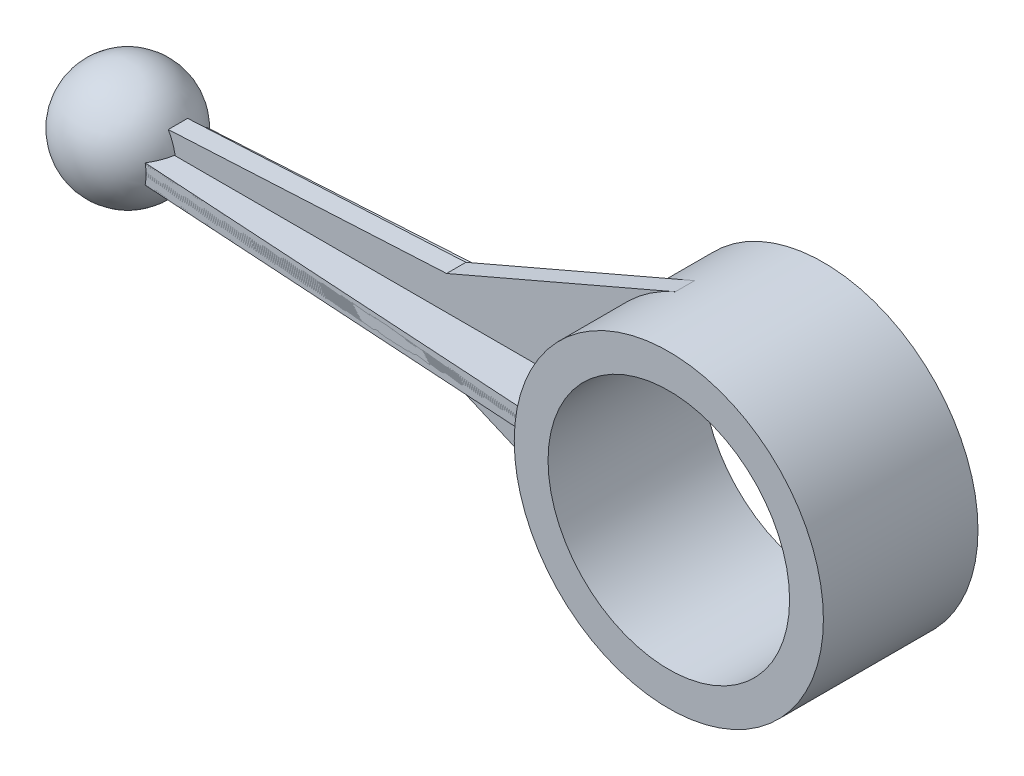
ISO-10303-21;
HEADER;
FILE_DESCRIPTION(('STEP AP214'),'2;1');
FILE_NAME('part.step','',(''),(''),'','','');
FILE_SCHEMA(('AUTOMOTIVE_DESIGN { 1 0 10303 214 1 1 1 1 }'));
ENDSEC;
DATA;
#1=APPLICATION_CONTEXT('core data for automotive mechanical design processes');
#2=APPLICATION_PROTOCOL_DEFINITION('international standard','automotive_design',2000,#1);
#3=PRODUCT_CONTEXT('',#1,'mechanical');
#4=PRODUCT('Part','Part','',(#3));
#5=PRODUCT_RELATED_PRODUCT_CATEGORY('part','',(#4));
#6=PRODUCT_DEFINITION_FORMATION('','',#4);
#7=PRODUCT_DEFINITION_CONTEXT('part definition',#1,'design');
#8=PRODUCT_DEFINITION('design','',#6,#7);
#9=PRODUCT_DEFINITION_SHAPE('','',#8);
#10=(LENGTH_UNIT() NAMED_UNIT(*) SI_UNIT(.MILLI.,.METRE.));
#11=(NAMED_UNIT(*) PLANE_ANGLE_UNIT() SI_UNIT($,.RADIAN.));
#12=(NAMED_UNIT(*) SI_UNIT($,.STERADIAN.) SOLID_ANGLE_UNIT());
#13=UNCERTAINTY_MEASURE_WITH_UNIT(LENGTH_MEASURE(1.E-05),#10,'distance_accuracy_value','');
#14=(GEOMETRIC_REPRESENTATION_CONTEXT(3) GLOBAL_UNCERTAINTY_ASSIGNED_CONTEXT((#13)) GLOBAL_UNIT_ASSIGNED_CONTEXT((#10,
#11,#12)) REPRESENTATION_CONTEXT('',''));
#15=CARTESIAN_POINT('',(0.,0.,0.));
#16=DIRECTION('',(0.,0.,1.));
#17=DIRECTION('',(1.,0.,0.));
#18=AXIS2_PLACEMENT_3D('',#15,#16,#17);
#19=CARTESIAN_POINT('',(-6.5,0.5,-3.));
#20=DIRECTION('',(-1.,0.,0.));
#21=DIRECTION('',(0.,0.,1.));
#22=AXIS2_PLACEMENT_3D('',#19,#20,#21);
#23=PLANE('',#22);
#24=DIRECTION('',(0.,0.,-1.));
#25=VECTOR('',#24,1.);
#26=CARTESIAN_POINT('',(-6.5,-0.5,-3.));
#27=LINE('',#26,#25);
#28=CARTESIAN_POINT('',(-6.5,-0.5,-0.499999999999999));
#29=VERTEX_POINT('',#28);
#30=CARTESIAN_POINT('',(-6.5,-0.5,-3.));
#31=VERTEX_POINT('',#30);
#32=EDGE_CURVE('E88',#29,#31,#27,.T.);
#33=ORIENTED_EDGE('',*,*,#32,.T.);
#34=DIRECTION('',(0.,-1.,0.));
#35=VECTOR('',#34,1.);
#36=CARTESIAN_POINT('',(-6.5,0.5,-3.));
#37=LINE('',#36,#35);
#38=CARTESIAN_POINT('',(-6.5,0.5,-3.));
#39=VERTEX_POINT('',#38);
#40=EDGE_CURVE('E12',#39,#31,#37,.T.);
#41=ORIENTED_EDGE('',*,*,#40,.F.);
#42=DIRECTION('',(0.,0.,-1.));
#43=VECTOR('',#42,1.);
#44=CARTESIAN_POINT('',(-6.5,0.5,-3.));
#45=LINE('',#44,#43);
#46=CARTESIAN_POINT('',(-6.5,0.5,-0.499999999999999));
#47=VERTEX_POINT('',#46);
#48=EDGE_CURVE('E107',#47,#39,#45,.T.);
#49=ORIENTED_EDGE('',*,*,#48,.F.);
#50=DIRECTION('',(0.,-1.,0.));
#51=VECTOR('',#50,1.);
#52=CARTESIAN_POINT('',(-6.5,0.5,-0.499999999999999));
#53=LINE('',#52,#51);
#54=EDGE_CURVE('E101',#47,#29,#53,.T.);
#55=ORIENTED_EDGE('',*,*,#54,.T.);
#56=EDGE_LOOP('',(#33,#41,#49,#55));
#57=FACE_BOUND('',#56,.T.);
#58=ADVANCED_FACE('F45',(#57),#23,.F.);
#59=CARTESIAN_POINT('',(-31.,0.5,-1.49999999999999));
#60=DIRECTION('',(0.0611100632795035,0.,0.99813103356522));
#61=DIRECTION('',(0.99813103356522,0.,-0.0611100632795035));
#62=AXIS2_PLACEMENT_3D('',#59,#60,#61);
#63=PLANE('',#62);
#64=DIRECTION('',(-0.99813103356522,0.,0.0611100632795035));
#65=VECTOR('',#64,1.);
#66=CARTESIAN_POINT('',(-31.,-0.5,-1.49999999999999));
#67=LINE('',#66,#65);
#68=CARTESIAN_POINT('',(-31.,-0.5,-1.49999999999999));
#69=VERTEX_POINT('',#68);
#70=EDGE_CURVE('E85',#31,#69,#67,.T.);
#71=ORIENTED_EDGE('',*,*,#70,.T.);
#72=DIRECTION('',(0.,-1.,0.));
#73=VECTOR('',#72,1.);
#74=CARTESIAN_POINT('',(-31.,0.5,-1.49999999999999));
#75=LINE('',#74,#73);
#76=CARTESIAN_POINT('',(-31.,0.5,-1.49999999999999));
#77=VERTEX_POINT('',#76);
#78=EDGE_CURVE('E52',#77,#69,#75,.T.);
#79=ORIENTED_EDGE('',*,*,#78,.F.);
#80=DIRECTION('',(-0.99813103356522,0.,0.0611100632795035));
#81=VECTOR('',#80,1.);
#82=CARTESIAN_POINT('',(-31.,0.5,-1.49999999999999));
#83=LINE('',#82,#81);
#84=EDGE_CURVE('E97',#39,#77,#83,.T.);
#85=ORIENTED_EDGE('',*,*,#84,.F.);
#86=ORIENTED_EDGE('',*,*,#40,.T.);
#87=EDGE_LOOP('',(#71,#79,#85,#86));
#88=FACE_BOUND('',#87,.T.);
#89=ADVANCED_FACE('F96',(#88),#63,.F.);
#90=CARTESIAN_POINT('',(-31.,0.5,-0.499999999999995));
#91=DIRECTION('',(1.,0.,0.));
#92=DIRECTION('',(0.,0.,-1.));
#93=AXIS2_PLACEMENT_3D('',#90,#91,#92);
#94=PLANE('',#93);
#95=DIRECTION('',(0.,0.,1.));
#96=VECTOR('',#95,1.);
#97=CARTESIAN_POINT('',(-31.,-0.5,-0.499999999999995));
#98=LINE('',#97,#96);
#99=CARTESIAN_POINT('',(-31.,-0.5,-0.499999999999995));
#100=VERTEX_POINT('',#99);
#101=EDGE_CURVE('E90',#69,#100,#98,.T.);
#102=ORIENTED_EDGE('',*,*,#101,.T.);
#103=DIRECTION('',(0.,-1.,0.));
#104=VECTOR('',#103,1.);
#105=CARTESIAN_POINT('',(-31.,0.5,-0.499999999999995));
#106=LINE('',#105,#104);
#107=CARTESIAN_POINT('',(-31.,0.5,-0.499999999999995));
#108=VERTEX_POINT('',#107);
#109=EDGE_CURVE('E113',#108,#100,#106,.T.);
#110=ORIENTED_EDGE('',*,*,#109,.F.);
#111=DIRECTION('',(0.,0.,1.));
#112=VECTOR('',#111,1.);
#113=CARTESIAN_POINT('',(-31.,0.5,-0.499999999999995));
#114=LINE('',#113,#112);
#115=EDGE_CURVE('E64',#77,#108,#114,.T.);
#116=ORIENTED_EDGE('',*,*,#115,.F.);
#117=ORIENTED_EDGE('',*,*,#78,.T.);
#118=EDGE_LOOP('',(#102,#110,#116,#117));
#119=FACE_BOUND('',#118,.T.);
#120=ADVANCED_FACE('F116',(#119),#94,.F.);
#121=CARTESIAN_POINT('',(-6.5,0.5,-0.499999999999999));
#122=DIRECTION('',(0.,0.,-1.));
#123=DIRECTION('',(-1.,0.,0.));
#124=AXIS2_PLACEMENT_3D('',#121,#122,#123);
#125=PLANE('',#124);
#126=DIRECTION('',(1.,0.,0.));
#127=VECTOR('',#126,1.);
#128=CARTESIAN_POINT('',(-6.5,-0.5,-0.499999999999999));
#129=LINE('',#128,#127);
#130=EDGE_CURVE('E105',#100,#29,#129,.T.);
#131=ORIENTED_EDGE('',*,*,#130,.T.);
#132=ORIENTED_EDGE('',*,*,#54,.F.);
#133=DIRECTION('',(1.,0.,0.));
#134=VECTOR('',#133,1.);
#135=CARTESIAN_POINT('',(-15.,0.5,-0.5));
#136=LINE('',#135,#134);
#137=EDGE_CURVE('E59',#108,#47,#136,.T.);
#138=ORIENTED_EDGE('',*,*,#137,.F.);
#139=ORIENTED_EDGE('',*,*,#109,.T.);
#140=EDGE_LOOP('',(#131,#132,#138,#139));
#141=FACE_BOUND('',#140,.T.);
#142=ADVANCED_FACE('F118',(#141),#125,.F.);
#143=CARTESIAN_POINT('',(-6.5,0.5,-0.499999999999999));
#144=DIRECTION('',(0.,-1.,0.));
#145=DIRECTION('',(0.,0.,-1.));
#146=AXIS2_PLACEMENT_3D('',#143,#144,#145);
#147=PLANE('',#146);
#148=ORIENTED_EDGE('',*,*,#48,.T.);
#149=ORIENTED_EDGE('',*,*,#84,.T.);
#150=ORIENTED_EDGE('',*,*,#115,.T.);
#151=ORIENTED_EDGE('',*,*,#137,.T.);
#152=EDGE_LOOP('',(#148,#149,#150,#151));
#153=FACE_BOUND('',#152,.T.);
#154=ADVANCED_FACE('F119',(#153),#147,.F.);
#155=CARTESIAN_POINT('',(-6.5,-0.5,-0.499999999999999));
#156=DIRECTION('',(0.,-1.,0.));
#157=DIRECTION('',(0.,0.,-1.));
#158=AXIS2_PLACEMENT_3D('',#155,#156,#157);
#159=PLANE('',#158);
#160=ORIENTED_EDGE('',*,*,#32,.F.);
#161=ORIENTED_EDGE('',*,*,#130,.F.);
#162=ORIENTED_EDGE('',*,*,#101,.F.);
#163=ORIENTED_EDGE('',*,*,#70,.F.);
#164=EDGE_LOOP('',(#160,#161,#162,#163));
#165=FACE_BOUND('',#164,.T.);
#166=ADVANCED_FACE('F86',(#165),#159,.T.);
#167=CLOSED_SHELL('',(#58,#89,#120,#142,#154,#166));
#168=MANIFOLD_SOLID_BREP('B2',#167);
#169=CARTESIAN_POINT('',(-32.,0.,0.));
#170=DIRECTION('',(0.,1.,0.));
#171=DIRECTION('',(1.,0.,0.));
#172=AXIS2_PLACEMENT_3D('',#169,#170,#171);
#173=SPHERICAL_SURFACE('',#172,3.);
#174=CARTESIAN_POINT('',(-32.0877593360996,0.,1.43340248962655));
#175=DIRECTION('',(0.0611100632795035,0.,-0.99813103356522));
#176=DIRECTION('',(-0.99813103356522,0.,-0.0611100632795035));
#177=AXIS2_PLACEMENT_3D('',#174,#175,#176);
#178=CIRCLE('',#177,2.63394297615946);
#179=CARTESIAN_POINT('',(-29.5065423839267,-0.5,1.59143618057591));
#180=VERTEX_POINT('',#179);
#181=CARTESIAN_POINT('',(-29.5065423839267,0.5,1.59143618057591));
#182=VERTEX_POINT('',#181);
#183=EDGE_CURVE('E187',#180,#182,#178,.F.);
#184=ORIENTED_EDGE('',*,*,#183,.T.);
#185=CARTESIAN_POINT('',(-32.,0.5,0.));
#186=DIRECTION('',(0.,-1.,0.));
#187=DIRECTION('',(0.,0.,-1.));
#188=AXIS2_PLACEMENT_3D('',#185,#186,#187);
#189=CIRCLE('',#188,2.95803989154981);
#190=CARTESIAN_POINT('',(-29.0845240525774,0.5,0.500000000000002));
#191=VERTEX_POINT('',#190);
#192=EDGE_CURVE('E43',#182,#191,#189,.F.);
#193=ORIENTED_EDGE('',*,*,#192,.T.);
#194=CARTESIAN_POINT('',(-32.,0.,0.500000000000001));
#195=DIRECTION('',(0.,0.,1.));
#196=DIRECTION('',(1.,0.,0.));
#197=AXIS2_PLACEMENT_3D('',#194,#195,#196);
#198=CIRCLE('',#197,2.95803989154981);
#199=CARTESIAN_POINT('',(-29.0845240525774,-0.5,0.500000000000001));
#200=VERTEX_POINT('',#199);
#201=EDGE_CURVE('E249',#191,#200,#198,.F.);
#202=ORIENTED_EDGE('',*,*,#201,.T.);
#203=CARTESIAN_POINT('',(-32.,-0.5,0.));
#204=DIRECTION('',(0.,-1.,0.));
#205=DIRECTION('',(0.,0.,-1.));
#206=AXIS2_PLACEMENT_3D('',#203,#204,#205);
#207=CIRCLE('',#206,2.95803989154981);
#208=EDGE_CURVE('E247',#180,#200,#207,.F.);
#209=ORIENTED_EDGE('',*,*,#208,.F.);
#210=EDGE_LOOP('',(#184,#193,#202,#209));
#211=FACE_BOUND('',#210,.T.);
#212=ADVANCED_FACE('F180',(#211),#173,.T.);
#213=CARTESIAN_POINT('',(-6.5,0.5,3.));
#214=DIRECTION('',(-1.,0.,0.));
#215=DIRECTION('',(0.,0.,-1.));
#216=AXIS2_PLACEMENT_3D('',#213,#214,#215);
#217=PLANE('',#216);
#218=DIRECTION('',(0.,0.,1.));
#219=VECTOR('',#218,1.);
#220=CARTESIAN_POINT('',(-6.5,-0.5,3.));
#221=LINE('',#220,#219);
#222=CARTESIAN_POINT('',(-6.5,-0.5,0.499999999999999));
#223=VERTEX_POINT('',#222);
#224=CARTESIAN_POINT('',(-6.5,-0.5,3.));
#225=VERTEX_POINT('',#224);
#226=EDGE_CURVE('E231',#223,#225,#221,.T.);
#227=ORIENTED_EDGE('',*,*,#226,.F.);
#228=DIRECTION('',(0.,-1.,0.));
#229=VECTOR('',#228,1.);
#230=CARTESIAN_POINT('',(-6.5,0.5,0.499999999999999));
#231=LINE('',#230,#229);
#232=CARTESIAN_POINT('',(-6.5,0.5,0.499999999999999));
#233=VERTEX_POINT('',#232);
#234=EDGE_CURVE('E225',#233,#223,#231,.T.);
#235=ORIENTED_EDGE('',*,*,#234,.F.);
#236=DIRECTION('',(0.,0.,1.));
#237=VECTOR('',#236,1.);
#238=CARTESIAN_POINT('',(-6.5,0.5,3.));
#239=LINE('',#238,#237);
#240=CARTESIAN_POINT('',(-6.5,0.5,3.));
#241=VERTEX_POINT('',#240);
#242=EDGE_CURVE('E233',#233,#241,#239,.T.);
#243=ORIENTED_EDGE('',*,*,#242,.T.);
#244=DIRECTION('',(0.,-1.,0.));
#245=VECTOR('',#244,1.);
#246=CARTESIAN_POINT('',(-6.5,0.5,3.));
#247=LINE('',#246,#245);
#248=EDGE_CURVE('E219',#241,#225,#247,.T.);
#249=ORIENTED_EDGE('',*,*,#248,.T.);
#250=EDGE_LOOP('',(#227,#235,#243,#249));
#251=FACE_BOUND('',#250,.T.);
#252=ADVANCED_FACE('F229',(#251),#217,.F.);
#253=CARTESIAN_POINT('',(-31.,0.5,1.49999999999999));
#254=DIRECTION('',(0.0611100632795035,0.,-0.99813103356522));
#255=DIRECTION('',(0.99813103356522,0.,0.0611100632795035));
#256=AXIS2_PLACEMENT_3D('',#253,#254,#255);
#257=PLANE('',#256);
#258=ORIENTED_EDGE('',*,*,#183,.F.);
#259=DIRECTION('',(-0.99813103356522,0.,-0.0611100632795035));
#260=VECTOR('',#259,1.);
#261=CARTESIAN_POINT('',(-31.,-0.5,1.49999999999999));
#262=LINE('',#261,#260);
#263=EDGE_CURVE('E215',#225,#180,#262,.T.);
#264=ORIENTED_EDGE('',*,*,#263,.F.);
#265=ORIENTED_EDGE('',*,*,#248,.F.);
#266=DIRECTION('',(-0.99813103356522,0.,-0.0611100632795035));
#267=VECTOR('',#266,1.);
#268=CARTESIAN_POINT('',(-31.,0.5,1.49999999999999));
#269=LINE('',#268,#267);
#270=EDGE_CURVE('E224',#241,#182,#269,.T.);
#271=ORIENTED_EDGE('',*,*,#270,.T.);
#272=EDGE_LOOP('',(#258,#264,#265,#271));
#273=FACE_BOUND('',#272,.T.);
#274=ADVANCED_FACE('F217',(#273),#257,.F.);
#275=CARTESIAN_POINT('',(-6.5,0.5,0.499999999999999));
#276=DIRECTION('',(0.,0.,1.));
#277=DIRECTION('',(-1.,0.,0.));
#278=AXIS2_PLACEMENT_3D('',#275,#276,#277);
#279=PLANE('',#278);
#280=ORIENTED_EDGE('',*,*,#201,.F.);
#281=DIRECTION('',(1.,0.,0.));
#282=VECTOR('',#281,1.);
#283=CARTESIAN_POINT('',(-15.,0.5,0.5));
#284=LINE('',#283,#282);
#285=EDGE_CURVE('E245',#191,#233,#284,.T.);
#286=ORIENTED_EDGE('',*,*,#285,.T.);
#287=ORIENTED_EDGE('',*,*,#234,.T.);
#288=DIRECTION('',(1.,0.,0.));
#289=VECTOR('',#288,1.);
#290=CARTESIAN_POINT('',(-6.5,-0.5,0.499999999999999));
#291=LINE('',#290,#289);
#292=EDGE_CURVE('E237',#200,#223,#291,.T.);
#293=ORIENTED_EDGE('',*,*,#292,.F.);
#294=EDGE_LOOP('',(#280,#286,#287,#293));
#295=FACE_BOUND('',#294,.T.);
#296=ADVANCED_FACE('F252',(#295),#279,.F.);
#297=CARTESIAN_POINT('',(-6.5,0.5,0.499999999999999));
#298=DIRECTION('',(0.,-1.,0.));
#299=DIRECTION('',(0.,0.,1.));
#300=AXIS2_PLACEMENT_3D('',#297,#298,#299);
#301=PLANE('',#300);
#302=ORIENTED_EDGE('',*,*,#192,.F.);
#303=ORIENTED_EDGE('',*,*,#270,.F.);
#304=ORIENTED_EDGE('',*,*,#242,.F.);
#305=ORIENTED_EDGE('',*,*,#285,.F.);
#306=EDGE_LOOP('',(#302,#303,#304,#305));
#307=FACE_BOUND('',#306,.T.);
#308=ADVANCED_FACE('F254',(#307),#301,.F.);
#309=CARTESIAN_POINT('',(-6.5,-0.5,0.499999999999999));
#310=DIRECTION('',(0.,-1.,0.));
#311=DIRECTION('',(0.,0.,1.));
#312=AXIS2_PLACEMENT_3D('',#309,#310,#311);
#313=PLANE('',#312);
#314=ORIENTED_EDGE('',*,*,#263,.T.);
#315=ORIENTED_EDGE('',*,*,#208,.T.);
#316=ORIENTED_EDGE('',*,*,#292,.T.);
#317=ORIENTED_EDGE('',*,*,#226,.T.);
#318=EDGE_LOOP('',(#314,#315,#316,#317));
#319=FACE_BOUND('',#318,.T.);
#320=ADVANCED_FACE('F235',(#319),#313,.T.);
#321=CLOSED_SHELL('',(#212,#252,#274,#296,#308,#320));
#322=MANIFOLD_SOLID_BREP('B6',#321);
#323=CARTESIAN_POINT('',(0.,0.,4.));
#324=DIRECTION('',(0.,0.,-1.));
#325=DIRECTION('',(-1.,0.,0.));
#326=AXIS2_PLACEMENT_3D('',#323,#324,#325);
#327=CYLINDRICAL_SURFACE('',#326,8.);
#328=CARTESIAN_POINT('',(0.,0.,-4.));
#329=DIRECTION('',(0.,0.,1.));
#330=DIRECTION('',(1.,0.,0.));
#331=AXIS2_PLACEMENT_3D('',#328,#329,#330);
#332=CIRCLE('',#331,8.);
#333=CARTESIAN_POINT('',(8.,0.,-4.));
#334=VERTEX_POINT('',#333);
#335=EDGE_CURVE('E477',#334,#334,#332,.T.);
#336=ORIENTED_EDGE('',*,*,#335,.T.);
#337=EDGE_LOOP('',(#336));
#338=FACE_BOUND('',#337,.T.);
#339=CARTESIAN_POINT('',(0.,0.,4.));
#340=DIRECTION('',(0.,0.,1.));
#341=DIRECTION('',(1.,0.,0.));
#342=AXIS2_PLACEMENT_3D('',#339,#340,#341);
#343=CIRCLE('',#342,8.);
#344=CARTESIAN_POINT('',(8.,0.,4.));
#345=VERTEX_POINT('',#344);
#346=EDGE_CURVE('E480',#345,#345,#343,.T.);
#347=ORIENTED_EDGE('',*,*,#346,.F.);
#348=EDGE_LOOP('',(#347));
#349=FACE_BOUND('',#348,.T.);
#350=DIRECTION('',(0.,0.,-1.));
#351=VECTOR('',#350,1.);
#352=CARTESIAN_POINT('',(-7.98435971133565,0.5,4.));
#353=LINE('',#352,#351);
#354=CARTESIAN_POINT('',(-7.98435971133567,0.5,2.90912083399986));
#355=VERTEX_POINT('',#354);
#356=CARTESIAN_POINT('',(-7.98435971133566,0.5,0.5));
#357=VERTEX_POINT('',#356);
#358=EDGE_CURVE('E320',#355,#357,#353,.T.);
#359=ORIENTED_EDGE('',*,*,#358,.F.);
#360=CARTESIAN_POINT('',(0.,0.,3.39795918367347));
#361=DIRECTION('',(0.0611100632795035,0.,-0.99813103356522));
#362=DIRECTION('',(-0.99813103356522,0.,-0.0611100632795035));
#363=AXIS2_PLACEMENT_3D('',#360,#361,#362);
#364=ELLIPSE('',#363,8.01497972808723,8.);
#365=CARTESIAN_POINT('',(-7.98435971133566,-0.5,2.90912083399986));
#366=VERTEX_POINT('',#365);
#367=EDGE_CURVE('E178',#366,#355,#364,.T.);
#368=ORIENTED_EDGE('',*,*,#367,.F.);
#369=DIRECTION('',(0.,0.,-1.));
#370=VECTOR('',#369,1.);
#371=CARTESIAN_POINT('',(-7.98435971133565,-0.5,4.));
#372=LINE('',#371,#370);
#373=CARTESIAN_POINT('',(-7.98435971133566,-0.5,0.499999999999999));
#374=VERTEX_POINT('',#373);
#375=EDGE_CURVE('E392',#366,#374,#372,.T.);
#376=ORIENTED_EDGE('',*,*,#375,.T.);
#377=CARTESIAN_POINT('',(0.,0.,0.5));
#378=DIRECTION('',(0.,0.,-1.));
#379=DIRECTION('',(1.,0.,0.));
#380=AXIS2_PLACEMENT_3D('',#377,#378,#379);
#381=CIRCLE('',#380,8.);
#382=CARTESIAN_POINT('',(-3.1645425419637,-7.34749416468649,0.5));
#383=VERTEX_POINT('',#382);
#384=EDGE_CURVE('E456',#383,#374,#381,.T.);
#385=ORIENTED_EDGE('',*,*,#384,.F.);
#386=DIRECTION('',(0.,0.,-1.));
#387=VECTOR('',#386,1.);
#388=CARTESIAN_POINT('',(-3.1645425419637,-7.34749416468649,0.5));
#389=LINE('',#388,#387);
#390=CARTESIAN_POINT('',(-3.16454254196369,-7.34749416468649,-0.5));
#391=VERTEX_POINT('',#390);
#392=EDGE_CURVE('E434',#383,#391,#389,.T.);
#393=ORIENTED_EDGE('',*,*,#392,.T.);
#394=CARTESIAN_POINT('',(0.,0.,-0.5));
#395=DIRECTION('',(0.,0.,-1.));
#396=DIRECTION('',(1.,0.,0.));
#397=AXIS2_PLACEMENT_3D('',#394,#395,#396);
#398=CIRCLE('',#397,8.);
#399=CARTESIAN_POINT('',(-3.1645425419637,7.34749416468649,-0.5));
#400=VERTEX_POINT('',#399);
#401=EDGE_CURVE('E444',#391,#400,#398,.T.);
#402=ORIENTED_EDGE('',*,*,#401,.T.);
#403=DIRECTION('',(0.,0.,-1.));
#404=VECTOR('',#403,1.);
#405=CARTESIAN_POINT('',(-3.1645425419637,7.34749416468649,0.5));
#406=LINE('',#405,#404);
#407=CARTESIAN_POINT('',(-3.1645425419637,7.34749416468649,0.5));
#408=VERTEX_POINT('',#407);
#409=EDGE_CURVE('E468',#408,#400,#406,.T.);
#410=ORIENTED_EDGE('',*,*,#409,.F.);
#411=EDGE_CURVE('E454',#357,#408,#381,.T.);
#412=ORIENTED_EDGE('',*,*,#411,.F.);
#413=EDGE_LOOP('',(#359,#368,#376,#385,#393,#402,#410,#412));
#414=FACE_BOUND('',#413,.T.);
#415=ADVANCED_FACE('F306',(#338,#349,#414),#327,.T.);
#416=CARTESIAN_POINT('',(-32.,0.,0.5));
#417=DIRECTION('',(0.,0.,1.));
#418=DIRECTION('',(1.,0.,0.));
#419=AXIS2_PLACEMENT_3D('',#416,#417,#418);
#420=PLANE('',#419);
#421=CARTESIAN_POINT('',(-32.,0.,0.5));
#422=DIRECTION('',(0.,0.,-1.));
#423=DIRECTION('',(1.,0.,0.));
#424=AXIS2_PLACEMENT_3D('',#421,#422,#423);
#425=CIRCLE('',#424,3.);
#426=CARTESIAN_POINT('',(-29.4019237886467,1.5,0.5));
#427=VERTEX_POINT('',#426);
#428=CARTESIAN_POINT('',(-29.0419601084502,0.5,0.5));
#429=VERTEX_POINT('',#428);
#430=EDGE_CURVE('E451',#427,#429,#425,.T.);
#431=ORIENTED_EDGE('',*,*,#430,.T.);
#432=DIRECTION('',(1.,0.,0.));
#433=VECTOR('',#432,1.);
#434=CARTESIAN_POINT('',(-32.,0.5,0.5));
#435=LINE('',#434,#433);
#436=EDGE_CURVE('E313',#429,#357,#435,.T.);
#437=ORIENTED_EDGE('',*,*,#436,.T.);
#438=ORIENTED_EDGE('',*,*,#411,.T.);
#439=DIRECTION('',(-0.918436770585811,-0.395567817745462,0.));
#440=VECTOR('',#439,1.);
#441=CARTESIAN_POINT('',(-15.,2.25,0.5));
#442=LINE('',#441,#440);
#443=CARTESIAN_POINT('',(-15.,2.25,0.5));
#444=VERTEX_POINT('',#443);
#445=EDGE_CURVE('E458',#408,#444,#442,.T.);
#446=ORIENTED_EDGE('',*,*,#445,.T.);
#447=DIRECTION('',(-0.998646777307309,-0.0520059051812871,0.));
#448=VECTOR('',#447,1.);
#449=CARTESIAN_POINT('',(-29.4019237886467,1.5,0.5));
#450=LINE('',#449,#448);
#451=EDGE_CURVE('E460',#444,#427,#450,.T.);
#452=ORIENTED_EDGE('',*,*,#451,.T.);
#453=EDGE_LOOP('',(#431,#437,#438,#446,#452));
#454=FACE_BOUND('',#453,.T.);
#455=ADVANCED_FACE('F486',(#454),#420,.T.);
#456=CARTESIAN_POINT('',(0.,0.,4.));
#457=DIRECTION('',(0.,0.,1.));
#458=DIRECTION('',(1.,0.,0.));
#459=AXIS2_PLACEMENT_3D('',#456,#457,#458);
#460=PLANE('',#459);
#461=CARTESIAN_POINT('',(0.,0.,4.));
#462=DIRECTION('',(0.,0.,1.));
#463=DIRECTION('',(1.,0.,0.));
#464=AXIS2_PLACEMENT_3D('',#461,#462,#463);
#465=CIRCLE('',#464,6.25);
#466=CARTESIAN_POINT('',(6.25,0.,4.));
#467=VERTEX_POINT('',#466);
#468=EDGE_CURVE('E471',#467,#467,#465,.T.);
#469=ORIENTED_EDGE('',*,*,#468,.F.);
#470=EDGE_LOOP('',(#469));
#471=FACE_BOUND('',#470,.T.);
#472=ORIENTED_EDGE('',*,*,#346,.T.);
#473=EDGE_LOOP('',(#472));
#474=FACE_BOUND('',#473,.T.);
#475=ADVANCED_FACE('F535',(#471,#474),#460,.T.);
#476=CARTESIAN_POINT('',(0.,0.,-4.));
#477=DIRECTION('',(0.,0.,1.));
#478=DIRECTION('',(1.,0.,0.));
#479=AXIS2_PLACEMENT_3D('',#476,#477,#478);
#480=PLANE('',#479);
#481=CARTESIAN_POINT('',(0.,0.,-4.));
#482=DIRECTION('',(0.,0.,1.));
#483=DIRECTION('',(1.,0.,0.));
#484=AXIS2_PLACEMENT_3D('',#481,#482,#483);
#485=CIRCLE('',#484,6.25);
#486=CARTESIAN_POINT('',(6.25,0.,-4.));
#487=VERTEX_POINT('',#486);
#488=EDGE_CURVE('E474',#487,#487,#485,.T.);
#489=ORIENTED_EDGE('',*,*,#488,.T.);
#490=EDGE_LOOP('',(#489));
#491=FACE_BOUND('',#490,.T.);
#492=ORIENTED_EDGE('',*,*,#335,.F.);
#493=EDGE_LOOP('',(#492));
#494=FACE_BOUND('',#493,.T.);
#495=ADVANCED_FACE('F541',(#491,#494),#480,.F.);
#496=CARTESIAN_POINT('',(0.,0.,-4.));
#497=DIRECTION('',(0.,0.,1.));
#498=DIRECTION('',(1.,0.,0.));
#499=AXIS2_PLACEMENT_3D('',#496,#497,#498);
#500=CYLINDRICAL_SURFACE('',#499,6.25);
#501=ORIENTED_EDGE('',*,*,#488,.F.);
#502=EDGE_LOOP('',(#501));
#503=FACE_BOUND('',#502,.T.);
#504=ORIENTED_EDGE('',*,*,#468,.T.);
#505=EDGE_LOOP('',(#504));
#506=FACE_BOUND('',#505,.T.);
#507=ADVANCED_FACE('F546',(#503,#506),#500,.F.);
#508=CARTESIAN_POINT('',(-32.,0.,0.5));
#509=DIRECTION('',(0.,0.,-1.));
#510=DIRECTION('',(-1.,0.,0.));
#511=AXIS2_PLACEMENT_3D('',#508,#509,#510);
#512=CYLINDRICAL_SURFACE('',#511,3.);
#513=CARTESIAN_POINT('',(-32.,0.,-0.5));
#514=DIRECTION('',(0.,0.,-1.));
#515=DIRECTION('',(1.,0.,0.));
#516=AXIS2_PLACEMENT_3D('',#513,#514,#515);
#517=CIRCLE('',#516,3.);
#518=CARTESIAN_POINT('',(-29.4019237886467,1.5,-0.5));
#519=VERTEX_POINT('',#518);
#520=CARTESIAN_POINT('',(-29.4019237886467,-1.5,-0.5));
#521=VERTEX_POINT('',#520);
#522=EDGE_CURVE('E442',#519,#521,#517,.T.);
#523=ORIENTED_EDGE('',*,*,#522,.T.);
#524=DIRECTION('',(0.,0.,-1.));
#525=VECTOR('',#524,1.);
#526=CARTESIAN_POINT('',(-29.4019237886467,-1.5,0.5));
#527=LINE('',#526,#525);
#528=CARTESIAN_POINT('',(-29.4019237886467,-1.5,0.5));
#529=VERTEX_POINT('',#528);
#530=EDGE_CURVE('E439',#529,#521,#527,.T.);
#531=ORIENTED_EDGE('',*,*,#530,.F.);
#532=CARTESIAN_POINT('',(-29.0419601084502,-0.5,0.5));
#533=VERTEX_POINT('',#532);
#534=EDGE_CURVE('E450',#533,#529,#425,.T.);
#535=ORIENTED_EDGE('',*,*,#534,.F.);
#536=EDGE_CURVE('E455',#429,#533,#425,.T.);
#537=ORIENTED_EDGE('',*,*,#536,.F.);
#538=ORIENTED_EDGE('',*,*,#430,.F.);
#539=DIRECTION('',(0.,0.,-1.));
#540=VECTOR('',#539,1.);
#541=CARTESIAN_POINT('',(-29.4019237886467,1.5,0.5));
#542=LINE('',#541,#540);
#543=EDGE_CURVE('E462',#427,#519,#542,.T.);
#544=ORIENTED_EDGE('',*,*,#543,.T.);
#545=EDGE_LOOP('',(#523,#531,#535,#537,#538,#544));
#546=FACE_BOUND('',#545,.T.);
#547=ADVANCED_FACE('F502',(#546),#512,.F.);
#548=CARTESIAN_POINT('',(-15.,2.25,0.5));
#549=DIRECTION('',(0.395567817745462,-0.918436770585811,0.));
#550=DIRECTION('',(0.918436770585811,0.395567817745462,0.));
#551=AXIS2_PLACEMENT_3D('',#548,#549,#550);
#552=PLANE('',#551);
#553=DIRECTION('',(-0.918436770585811,-0.395567817745462,0.));
#554=VECTOR('',#553,1.);
#555=CARTESIAN_POINT('',(-15.,2.25,-0.5));
#556=LINE('',#555,#554);
#557=CARTESIAN_POINT('',(-15.,2.25,-0.5));
#558=VERTEX_POINT('',#557);
#559=EDGE_CURVE('E446',#400,#558,#556,.T.);
#560=ORIENTED_EDGE('',*,*,#559,.T.);
#561=DIRECTION('',(0.,0.,-1.));
#562=VECTOR('',#561,1.);
#563=CARTESIAN_POINT('',(-15.,2.25,0.5));
#564=LINE('',#563,#562);
#565=EDGE_CURVE('E465',#444,#558,#564,.T.);
#566=ORIENTED_EDGE('',*,*,#565,.F.);
#567=ORIENTED_EDGE('',*,*,#445,.F.);
#568=ORIENTED_EDGE('',*,*,#409,.T.);
#569=EDGE_LOOP('',(#560,#566,#567,#568));
#570=FACE_BOUND('',#569,.T.);
#571=ADVANCED_FACE('F514',(#570),#552,.F.);
#572=CARTESIAN_POINT('',(-29.4019237886467,1.5,0.5));
#573=DIRECTION('',(0.0520059051812871,-0.99864677730731,0.));
#574=DIRECTION('',(0.99864677730731,0.0520059051812871,0.));
#575=AXIS2_PLACEMENT_3D('',#572,#573,#574);
#576=PLANE('',#575);
#577=DIRECTION('',(-0.998646777307309,-0.0520059051812871,0.));
#578=VECTOR('',#577,1.);
#579=CARTESIAN_POINT('',(-29.4019237886467,1.5,-0.5));
#580=LINE('',#579,#578);
#581=EDGE_CURVE('E448',#558,#519,#580,.T.);
#582=ORIENTED_EDGE('',*,*,#581,.T.);
#583=ORIENTED_EDGE('',*,*,#543,.F.);
#584=ORIENTED_EDGE('',*,*,#451,.F.);
#585=ORIENTED_EDGE('',*,*,#565,.T.);
#586=EDGE_LOOP('',(#582,#583,#584,#585));
#587=FACE_BOUND('',#586,.T.);
#588=ADVANCED_FACE('F520',(#587),#576,.F.);
#589=DIRECTION('',(1.,0.,0.));
#590=VECTOR('',#589,1.);
#591=CARTESIAN_POINT('',(-32.,-0.5,0.5));
#592=LINE('',#591,#590);
#593=EDGE_CURVE('E483',#533,#374,#592,.T.);
#594=ORIENTED_EDGE('',*,*,#593,.F.);
#595=ORIENTED_EDGE('',*,*,#534,.T.);
#596=DIRECTION('',(-0.998646777307309,0.0520059051812871,0.));
#597=VECTOR('',#596,1.);
#598=CARTESIAN_POINT('',(-29.4019237886467,-1.5,0.5));
#599=LINE('',#598,#597);
#600=CARTESIAN_POINT('',(-15.,-2.25,0.5));
#601=VERTEX_POINT('',#600);
#602=EDGE_CURVE('E428',#601,#529,#599,.T.);
#603=ORIENTED_EDGE('',*,*,#602,.F.);
#604=DIRECTION('',(-0.918436770585811,0.395567817745462,0.));
#605=VECTOR('',#604,1.);
#606=CARTESIAN_POINT('',(-15.,-2.25,0.5));
#607=LINE('',#606,#605);
#608=EDGE_CURVE('E431',#383,#601,#607,.T.);
#609=ORIENTED_EDGE('',*,*,#608,.F.);
#610=ORIENTED_EDGE('',*,*,#384,.T.);
#611=EDGE_LOOP('',(#594,#595,#603,#609,#610));
#612=FACE_BOUND('',#611,.T.);
#613=ADVANCED_FACE('F497',(#612),#420,.T.);
#614=CARTESIAN_POINT('',(-32.,0.,-0.5));
#615=DIRECTION('',(0.,0.,1.));
#616=DIRECTION('',(1.,0.,0.));
#617=AXIS2_PLACEMENT_3D('',#614,#615,#616);
#618=PLANE('',#617);
#619=ORIENTED_EDGE('',*,*,#522,.F.);
#620=ORIENTED_EDGE('',*,*,#581,.F.);
#621=ORIENTED_EDGE('',*,*,#559,.F.);
#622=ORIENTED_EDGE('',*,*,#401,.F.);
#623=DIRECTION('',(-0.918436770585811,0.395567817745462,0.));
#624=VECTOR('',#623,1.);
#625=CARTESIAN_POINT('',(-15.,-2.25,-0.5));
#626=LINE('',#625,#624);
#627=CARTESIAN_POINT('',(-15.,-2.25,-0.5));
#628=VERTEX_POINT('',#627);
#629=EDGE_CURVE('E425',#391,#628,#626,.T.);
#630=ORIENTED_EDGE('',*,*,#629,.T.);
#631=DIRECTION('',(-0.998646777307309,0.0520059051812871,0.));
#632=VECTOR('',#631,1.);
#633=CARTESIAN_POINT('',(-29.4019237886467,-1.5,-0.5));
#634=LINE('',#633,#632);
#635=EDGE_CURVE('E422',#628,#521,#634,.T.);
#636=ORIENTED_EDGE('',*,*,#635,.T.);
#637=EDGE_LOOP('',(#619,#620,#621,#622,#630,#636));
#638=FACE_BOUND('',#637,.T.);
#639=ADVANCED_FACE('F517',(#638),#618,.F.);
#640=CARTESIAN_POINT('',(-29.4019237886467,-1.5,0.5));
#641=DIRECTION('',(-0.0520059051812871,-0.99864677730731,0.));
#642=DIRECTION('',(0.99864677730731,-0.0520059051812871,0.));
#643=AXIS2_PLACEMENT_3D('',#640,#641,#642);
#644=PLANE('',#643);
#645=ORIENTED_EDGE('',*,*,#635,.F.);
#646=DIRECTION('',(0.,0.,-1.));
#647=VECTOR('',#646,1.);
#648=CARTESIAN_POINT('',(-15.,-2.25,0.5));
#649=LINE('',#648,#647);
#650=EDGE_CURVE('E437',#601,#628,#649,.T.);
#651=ORIENTED_EDGE('',*,*,#650,.F.);
#652=ORIENTED_EDGE('',*,*,#602,.T.);
#653=ORIENTED_EDGE('',*,*,#530,.T.);
#654=EDGE_LOOP('',(#645,#651,#652,#653));
#655=FACE_BOUND('',#654,.T.);
#656=ADVANCED_FACE('F506',(#655),#644,.T.);
#657=CARTESIAN_POINT('',(-15.,-2.25,0.5));
#658=DIRECTION('',(-0.395567817745462,-0.918436770585811,0.));
#659=DIRECTION('',(0.918436770585811,-0.395567817745462,0.));
#660=AXIS2_PLACEMENT_3D('',#657,#658,#659);
#661=PLANE('',#660);
#662=ORIENTED_EDGE('',*,*,#629,.F.);
#663=ORIENTED_EDGE('',*,*,#392,.F.);
#664=ORIENTED_EDGE('',*,*,#608,.T.);
#665=ORIENTED_EDGE('',*,*,#650,.T.);
#666=EDGE_LOOP('',(#662,#663,#664,#665));
#667=FACE_BOUND('',#666,.T.);
#668=ADVANCED_FACE('F510',(#667),#661,.T.);
#669=CARTESIAN_POINT('',(-31.,0.5,1.49999999999999));
#670=DIRECTION('',(0.0611100632795035,0.,-0.99813103356522));
#671=DIRECTION('',(0.99813103356522,0.,0.0611100632795035));
#672=AXIS2_PLACEMENT_3D('',#669,#670,#671);
#673=PLANE('',#672);
#674=DIRECTION('',(-0.99813103356522,0.,-0.0611100632795035));
#675=VECTOR('',#674,1.);
#676=CARTESIAN_POINT('',(-31.,-0.5,1.49999999999999));
#677=LINE('',#676,#675);
#678=CARTESIAN_POINT('',(-31.,-0.5,1.49999999999999));
#679=VERTEX_POINT('',#678);
#680=EDGE_CURVE('E386',#366,#679,#677,.T.);
#681=ORIENTED_EDGE('',*,*,#680,.F.);
#682=ORIENTED_EDGE('',*,*,#367,.T.);
#683=DIRECTION('',(-0.99813103356522,0.,-0.0611100632795035));
#684=VECTOR('',#683,1.);
#685=CARTESIAN_POINT('',(-31.,0.5,1.49999999999999));
#686=LINE('',#685,#684);
#687=CARTESIAN_POINT('',(-31.,0.5,1.49999999999999));
#688=VERTEX_POINT('',#687);
#689=EDGE_CURVE('E404',#355,#688,#686,.T.);
#690=ORIENTED_EDGE('',*,*,#689,.T.);
#691=DIRECTION('',(0.,-1.,0.));
#692=VECTOR('',#691,1.);
#693=CARTESIAN_POINT('',(-31.,0.5,1.49999999999999));
#694=LINE('',#693,#692);
#695=EDGE_CURVE('E395',#688,#679,#694,.T.);
#696=ORIENTED_EDGE('',*,*,#695,.T.);
#697=EDGE_LOOP('',(#681,#682,#690,#696));
#698=FACE_BOUND('',#697,.T.);
#699=ADVANCED_FACE('F406',(#698),#673,.F.);
#700=CARTESIAN_POINT('',(-6.5,0.5,0.499999999999999));
#701=DIRECTION('',(0.,0.,1.));
#702=DIRECTION('',(-1.,0.,0.));
#703=AXIS2_PLACEMENT_3D('',#700,#701,#702);
#704=PLANE('',#703);
#705=DIRECTION('',(1.,0.,0.));
#706=VECTOR('',#705,1.);
#707=CARTESIAN_POINT('',(-15.,0.5,0.5));
#708=LINE('',#707,#706);
#709=CARTESIAN_POINT('',(-31.,0.5,0.499999999999995));
#710=VERTEX_POINT('',#709);
#711=EDGE_CURVE('E417',#710,#429,#708,.T.);
#712=ORIENTED_EDGE('',*,*,#711,.T.);
#713=ORIENTED_EDGE('',*,*,#536,.T.);
#714=DIRECTION('',(1.,0.,0.));
#715=VECTOR('',#714,1.);
#716=CARTESIAN_POINT('',(-6.5,-0.5,0.499999999999999));
#717=LINE('',#716,#715);
#718=CARTESIAN_POINT('',(-31.,-0.5,0.499999999999995));
#719=VERTEX_POINT('',#718);
#720=EDGE_CURVE('E415',#719,#533,#717,.T.);
#721=ORIENTED_EDGE('',*,*,#720,.F.);
#722=DIRECTION('',(0.,-1.,0.));
#723=VECTOR('',#722,1.);
#724=CARTESIAN_POINT('',(-31.,0.5,0.499999999999995));
#725=LINE('',#724,#723);
#726=EDGE_CURVE('E403',#710,#719,#725,.T.);
#727=ORIENTED_EDGE('',*,*,#726,.F.);
#728=EDGE_LOOP('',(#712,#713,#721,#727));
#729=FACE_BOUND('',#728,.T.);
#730=ADVANCED_FACE('F494',(#729),#704,.F.);
#731=CARTESIAN_POINT('',(-6.5,0.5,0.499999999999999));
#732=DIRECTION('',(0.,-1.,0.));
#733=DIRECTION('',(0.,0.,1.));
#734=AXIS2_PLACEMENT_3D('',#731,#732,#733);
#735=PLANE('',#734);
#736=ORIENTED_EDGE('',*,*,#689,.F.);
#737=ORIENTED_EDGE('',*,*,#358,.T.);
#738=ORIENTED_EDGE('',*,*,#436,.F.);
#739=ORIENTED_EDGE('',*,*,#711,.F.);
#740=DIRECTION('',(0.,0.,-1.));
#741=VECTOR('',#740,1.);
#742=CARTESIAN_POINT('',(-31.,0.5,0.499999999999995));
#743=LINE('',#742,#741);
#744=EDGE_CURVE('E413',#688,#710,#743,.T.);
#745=ORIENTED_EDGE('',*,*,#744,.F.);
#746=EDGE_LOOP('',(#736,#737,#738,#739,#745));
#747=FACE_BOUND('',#746,.T.);
#748=ADVANCED_FACE('F491',(#747),#735,.F.);
#749=CARTESIAN_POINT('',(-6.5,-0.5,0.499999999999999));
#750=DIRECTION('',(0.,-1.,0.));
#751=DIRECTION('',(0.,0.,1.));
#752=AXIS2_PLACEMENT_3D('',#749,#750,#751);
#753=PLANE('',#752);
#754=ORIENTED_EDGE('',*,*,#375,.F.);
#755=ORIENTED_EDGE('',*,*,#680,.T.);
#756=DIRECTION('',(0.,0.,-1.));
#757=VECTOR('',#756,1.);
#758=CARTESIAN_POINT('',(-31.,-0.5,0.499999999999995));
#759=LINE('',#758,#757);
#760=EDGE_CURVE('E390',#679,#719,#759,.T.);
#761=ORIENTED_EDGE('',*,*,#760,.T.);
#762=ORIENTED_EDGE('',*,*,#720,.T.);
#763=ORIENTED_EDGE('',*,*,#593,.T.);
#764=EDGE_LOOP('',(#754,#755,#761,#762,#763));
#765=FACE_BOUND('',#764,.T.);
#766=ADVANCED_FACE('F388',(#765),#753,.T.);
#767=CARTESIAN_POINT('',(-31.,0.5,0.499999999999995));
#768=DIRECTION('',(1.,0.,0.));
#769=DIRECTION('',(0.,0.,1.));
#770=AXIS2_PLACEMENT_3D('',#767,#768,#769);
#771=PLANE('',#770);
#772=ORIENTED_EDGE('',*,*,#760,.F.);
#773=ORIENTED_EDGE('',*,*,#695,.F.);
#774=ORIENTED_EDGE('',*,*,#744,.T.);
#775=ORIENTED_EDGE('',*,*,#726,.T.);
#776=EDGE_LOOP('',(#772,#773,#774,#775));
#777=FACE_BOUND('',#776,.T.);
#778=ADVANCED_FACE('F400',(#777),#771,.F.);
#779=CLOSED_SHELL('',(#415,#455,#475,#495,#507,#547,#571,#588,#613,#639,#656,#668,#699,#730,
#748,#766,#778));
#780=MANIFOLD_SOLID_BREP('B37',#779);
#781=ADVANCED_BREP_SHAPE_REPRESENTATION('',(#18,#168,#322,#780),#14);
#782=SHAPE_DEFINITION_REPRESENTATION(#9,#781);
ENDSEC;
END-ISO-10303-21;
